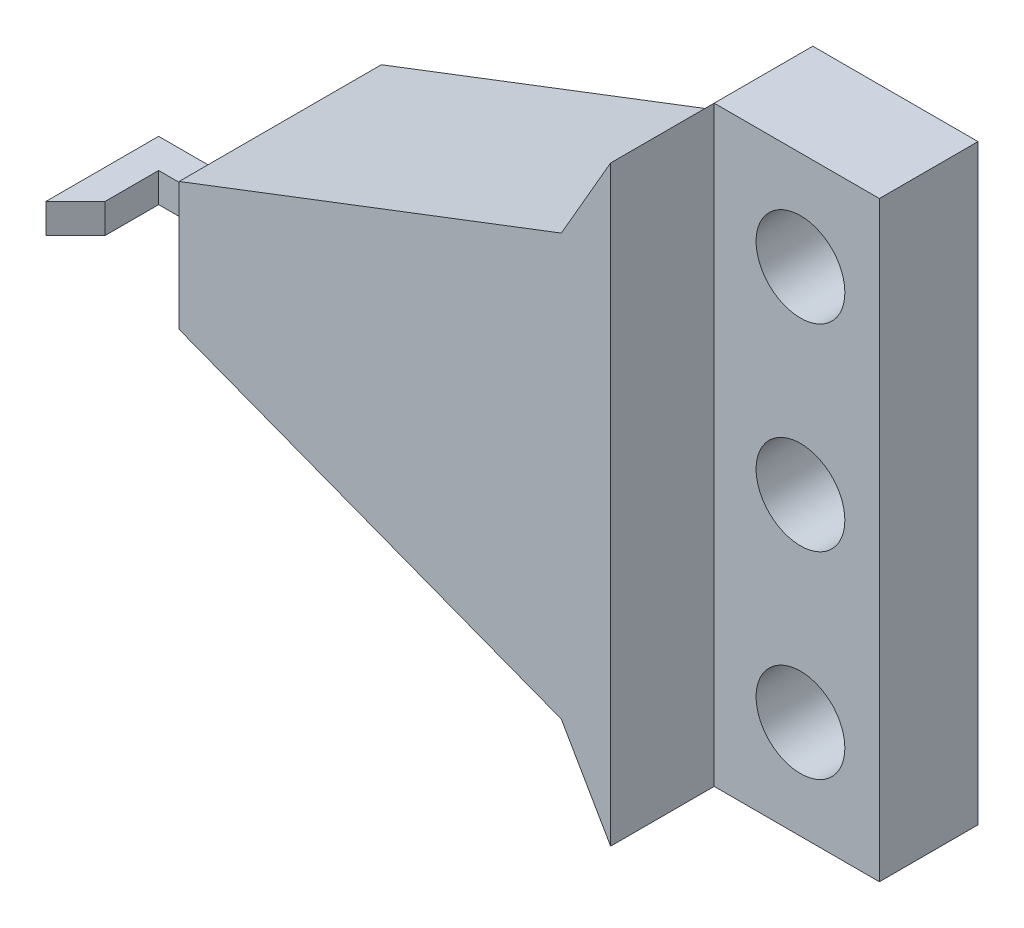
ISO-10303-21;
HEADER;
FILE_DESCRIPTION(('STEP AP214'),'2;1');
FILE_NAME('part.step','',(''),(''),'','','');
FILE_SCHEMA(('AUTOMOTIVE_DESIGN { 1 0 10303 214 1 1 1 1 }'));
ENDSEC;
DATA;
#1=APPLICATION_CONTEXT('core data for automotive mechanical design processes');
#2=APPLICATION_PROTOCOL_DEFINITION('international standard','automotive_design',2000,#1);
#3=PRODUCT_CONTEXT('',#1,'mechanical');
#4=PRODUCT('Part','Part','',(#3));
#5=PRODUCT_RELATED_PRODUCT_CATEGORY('part','',(#4));
#6=PRODUCT_DEFINITION_FORMATION('','',#4);
#7=PRODUCT_DEFINITION_CONTEXT('part definition',#1,'design');
#8=PRODUCT_DEFINITION('design','',#6,#7);
#9=PRODUCT_DEFINITION_SHAPE('','',#8);
#10=(LENGTH_UNIT() NAMED_UNIT(*) SI_UNIT(.MILLI.,.METRE.));
#11=(NAMED_UNIT(*) PLANE_ANGLE_UNIT() SI_UNIT($,.RADIAN.));
#12=(NAMED_UNIT(*) SI_UNIT($,.STERADIAN.) SOLID_ANGLE_UNIT());
#13=UNCERTAINTY_MEASURE_WITH_UNIT(LENGTH_MEASURE(1.E-05),#10,'distance_accuracy_value','');
#14=(GEOMETRIC_REPRESENTATION_CONTEXT(3) GLOBAL_UNCERTAINTY_ASSIGNED_CONTEXT((#13)) GLOBAL_UNIT_ASSIGNED_CONTEXT((#10,
#11,#12)) REPRESENTATION_CONTEXT('',''));
#15=CARTESIAN_POINT('',(0.,0.,0.));
#16=DIRECTION('',(0.,0.,1.));
#17=DIRECTION('',(1.,0.,0.));
#18=AXIS2_PLACEMENT_3D('',#15,#16,#17);
#19=CARTESIAN_POINT('',(-30.734,0.,10.414));
#20=DIRECTION('',(1.,0.,0.));
#21=DIRECTION('',(0.,0.,-1.));
#22=AXIS2_PLACEMENT_3D('',#19,#20,#21);
#23=PLANE('',#22);
#24=DIRECTION('',(0.,-1.,0.));
#25=VECTOR('',#24,1.);
#26=CARTESIAN_POINT('',(-30.734,0.,0.));
#27=LINE('',#26,#25);
#28=CARTESIAN_POINT('',(-30.734,-11.938,0.));
#29=VERTEX_POINT('',#28);
#30=CARTESIAN_POINT('',(-30.734,-18.542,0.));
#31=VERTEX_POINT('',#30);
#32=EDGE_CURVE('E262',#29,#31,#27,.T.);
#33=ORIENTED_EDGE('',*,*,#32,.T.);
#34=DIRECTION('',(0.,0.,-1.));
#35=VECTOR('',#34,1.);
#36=CARTESIAN_POINT('',(-30.734,-18.542,10.414));
#37=LINE('',#36,#35);
#38=CARTESIAN_POINT('',(-30.734,-18.542,10.414));
#39=VERTEX_POINT('',#38);
#40=EDGE_CURVE('E276',#39,#31,#37,.T.);
#41=ORIENTED_EDGE('',*,*,#40,.F.);
#42=DIRECTION('',(0.,-1.,0.));
#43=VECTOR('',#42,1.);
#44=CARTESIAN_POINT('',(-30.734,0.,10.414));
#45=LINE('',#44,#43);
#46=CARTESIAN_POINT('',(-30.734,-11.938,10.414));
#47=VERTEX_POINT('',#46);
#48=EDGE_CURVE('E246',#47,#39,#45,.T.);
#49=ORIENTED_EDGE('',*,*,#48,.F.);
#50=DIRECTION('',(0.,0.,-1.));
#51=VECTOR('',#50,1.);
#52=CARTESIAN_POINT('',(-30.734,-11.938,10.414));
#53=LINE('',#52,#51);
#54=EDGE_CURVE('E280',#47,#29,#53,.T.);
#55=ORIENTED_EDGE('',*,*,#54,.T.);
#56=EDGE_LOOP('',(#33,#41,#49,#55));
#57=FACE_BOUND('',#56,.T.);
#58=DIRECTION('',(0.,0.,1.));
#59=VECTOR('',#58,1.);
#60=CARTESIAN_POINT('',(-30.734,-14.478,0.));
#61=LINE('',#60,#59);
#62=CARTESIAN_POINT('',(-30.734,-14.478,6.39));
#63=VERTEX_POINT('',#62);
#64=CARTESIAN_POINT('',(-30.734,-14.478,7.914));
#65=VERTEX_POINT('',#64);
#66=EDGE_CURVE('E209',#63,#65,#61,.T.);
#67=ORIENTED_EDGE('',*,*,#66,.T.);
#68=DIRECTION('',(0.,-1.,0.));
#69=VECTOR('',#68,1.);
#70=CARTESIAN_POINT('',(-30.734,-14.478,7.914));
#71=LINE('',#70,#69);
#72=CARTESIAN_POINT('',(-30.734,-16.002,7.914));
#73=VERTEX_POINT('',#72);
#74=EDGE_CURVE('E225',#65,#73,#71,.T.);
#75=ORIENTED_EDGE('',*,*,#74,.T.);
#76=DIRECTION('',(0.,0.,1.));
#77=VECTOR('',#76,1.);
#78=CARTESIAN_POINT('',(-30.734,-16.002,0.));
#79=LINE('',#78,#77);
#80=CARTESIAN_POINT('',(-30.734,-16.002,6.39));
#81=VERTEX_POINT('',#80);
#82=EDGE_CURVE('E190',#81,#73,#79,.T.);
#83=ORIENTED_EDGE('',*,*,#82,.F.);
#84=DIRECTION('',(0.,-1.,0.));
#85=VECTOR('',#84,1.);
#86=CARTESIAN_POINT('',(-30.734,-14.478,6.39));
#87=LINE('',#86,#85);
#88=EDGE_CURVE('E229',#63,#81,#87,.T.);
#89=ORIENTED_EDGE('',*,*,#88,.F.);
#90=EDGE_LOOP('',(#67,#75,#83,#89));
#91=FACE_BOUND('',#90,.T.);
#92=ADVANCED_FACE('F45',(#57,#91),#23,.F.);
#93=CARTESIAN_POINT('',(0.,0.,5.08));
#94=DIRECTION('',(0.,-1.,0.));
#95=DIRECTION('',(1.,0.,0.));
#96=AXIS2_PLACEMENT_3D('',#93,#94,#95);
#97=PLANE('',#96);
#98=DIRECTION('',(-1.,0.,0.));
#99=VECTOR('',#98,1.);
#100=CARTESIAN_POINT('',(0.,0.,0.));
#101=LINE('',#100,#99);
#102=CARTESIAN_POINT('',(0.,0.,0.));
#103=VERTEX_POINT('',#102);
#104=CARTESIAN_POINT('',(-8.509,0.,0.));
#105=VERTEX_POINT('',#104);
#106=EDGE_CURVE('E330',#103,#105,#101,.T.);
#107=ORIENTED_EDGE('',*,*,#106,.T.);
#108=DIRECTION('',(0.,0.,-1.));
#109=VECTOR('',#108,1.);
#110=CARTESIAN_POINT('',(-8.509,0.,5.08));
#111=LINE('',#110,#109);
#112=CARTESIAN_POINT('',(-8.509,0.,5.08));
#113=VERTEX_POINT('',#112);
#114=EDGE_CURVE('E11',#113,#105,#111,.T.);
#115=ORIENTED_EDGE('',*,*,#114,.F.);
#116=DIRECTION('',(-1.,0.,0.));
#117=VECTOR('',#116,1.);
#118=CARTESIAN_POINT('',(0.,0.,5.08));
#119=LINE('',#118,#117);
#120=CARTESIAN_POINT('',(0.,0.,5.08));
#121=VERTEX_POINT('',#120);
#122=EDGE_CURVE('E304',#121,#113,#119,.T.);
#123=ORIENTED_EDGE('',*,*,#122,.F.);
#124=DIRECTION('',(0.,0.,-1.));
#125=VECTOR('',#124,1.);
#126=CARTESIAN_POINT('',(0.,0.,5.08));
#127=LINE('',#126,#125);
#128=EDGE_CURVE('E70',#121,#103,#127,.T.);
#129=ORIENTED_EDGE('',*,*,#128,.T.);
#130=EDGE_LOOP('',(#107,#115,#123,#129));
#131=FACE_BOUND('',#130,.T.);
#132=ADVANCED_FACE('F392',(#131),#97,.F.);
#133=CARTESIAN_POINT('',(0.,-30.48,5.08));
#134=DIRECTION('',(0.,-1.,0.));
#135=DIRECTION('',(1.,0.,0.));
#136=AXIS2_PLACEMENT_3D('',#133,#134,#135);
#137=PLANE('',#136);
#138=DIRECTION('',(-1.,0.,0.));
#139=VECTOR('',#138,1.);
#140=CARTESIAN_POINT('',(0.,-30.48,0.));
#141=LINE('',#140,#139);
#142=CARTESIAN_POINT('',(0.,-30.48,0.));
#143=VERTEX_POINT('',#142);
#144=CARTESIAN_POINT('',(-8.509,-30.48,0.));
#145=VERTEX_POINT('',#144);
#146=EDGE_CURVE('E333',#143,#145,#141,.T.);
#147=ORIENTED_EDGE('',*,*,#146,.F.);
#148=DIRECTION('',(0.,0.,-1.));
#149=VECTOR('',#148,1.);
#150=CARTESIAN_POINT('',(0.,-30.48,5.08));
#151=LINE('',#150,#149);
#152=CARTESIAN_POINT('',(0.,-30.48,5.08));
#153=VERTEX_POINT('',#152);
#154=EDGE_CURVE('E342',#153,#143,#151,.T.);
#155=ORIENTED_EDGE('',*,*,#154,.F.);
#156=DIRECTION('',(-1.,0.,0.));
#157=VECTOR('',#156,1.);
#158=CARTESIAN_POINT('',(0.,-30.48,5.08));
#159=LINE('',#158,#157);
#160=CARTESIAN_POINT('',(-8.509,-30.48,5.08));
#161=VERTEX_POINT('',#160);
#162=EDGE_CURVE('E312',#153,#161,#159,.T.);
#163=ORIENTED_EDGE('',*,*,#162,.T.);
#164=DIRECTION('',(0.,0.,-1.));
#165=VECTOR('',#164,1.);
#166=CARTESIAN_POINT('',(-8.509,-30.48,5.08));
#167=LINE('',#166,#165);
#168=EDGE_CURVE('E54',#161,#145,#167,.T.);
#169=ORIENTED_EDGE('',*,*,#168,.T.);
#170=EDGE_LOOP('',(#147,#155,#163,#169));
#171=FACE_BOUND('',#170,.T.);
#172=ADVANCED_FACE('F348',(#171),#137,.T.);
#173=CARTESIAN_POINT('',(-4.064,-5.08,5.08));
#174=DIRECTION('',(0.,0.,-1.));
#175=DIRECTION('',(-1.,0.,0.));
#176=AXIS2_PLACEMENT_3D('',#173,#174,#175);
#177=CYLINDRICAL_SURFACE('',#176,2.286);
#178=CARTESIAN_POINT('',(-4.064,-5.08,5.08));
#179=DIRECTION('',(0.,0.,1.));
#180=DIRECTION('',(1.,0.,0.));
#181=AXIS2_PLACEMENT_3D('',#178,#179,#180);
#182=CIRCLE('',#181,2.286);
#183=CARTESIAN_POINT('',(-1.778,-5.08,5.08));
#184=VERTEX_POINT('',#183);
#185=EDGE_CURVE('E300',#184,#184,#182,.T.);
#186=ORIENTED_EDGE('',*,*,#185,.T.);
#187=EDGE_LOOP('',(#186));
#188=FACE_BOUND('',#187,.T.);
#189=CARTESIAN_POINT('',(-4.064,-5.08,0.));
#190=DIRECTION('',(0.,0.,1.));
#191=DIRECTION('',(1.,0.,0.));
#192=AXIS2_PLACEMENT_3D('',#189,#190,#191);
#193=CIRCLE('',#192,2.286);
#194=CARTESIAN_POINT('',(-1.778,-5.08,0.));
#195=VERTEX_POINT('',#194);
#196=EDGE_CURVE('E326',#195,#195,#193,.T.);
#197=ORIENTED_EDGE('',*,*,#196,.F.);
#198=EDGE_LOOP('',(#197));
#199=FACE_BOUND('',#198,.T.);
#200=ADVANCED_FACE('F414',(#188,#199),#177,.F.);
#201=CARTESIAN_POINT('',(-4.064,-25.4,5.08));
#202=DIRECTION('',(0.,0.,-1.));
#203=DIRECTION('',(-1.,0.,0.));
#204=AXIS2_PLACEMENT_3D('',#201,#202,#203);
#205=CYLINDRICAL_SURFACE('',#204,2.286);
#206=CARTESIAN_POINT('',(-4.064,-25.4,5.08));
#207=DIRECTION('',(0.,0.,1.));
#208=DIRECTION('',(1.,0.,0.));
#209=AXIS2_PLACEMENT_3D('',#206,#207,#208);
#210=CIRCLE('',#209,2.286);
#211=CARTESIAN_POINT('',(-1.778,-25.4,5.08));
#212=VERTEX_POINT('',#211);
#213=EDGE_CURVE('E295',#212,#212,#210,.T.);
#214=ORIENTED_EDGE('',*,*,#213,.T.);
#215=EDGE_LOOP('',(#214));
#216=FACE_BOUND('',#215,.T.);
#217=CARTESIAN_POINT('',(-4.064,-25.4,0.));
#218=DIRECTION('',(0.,0.,1.));
#219=DIRECTION('',(1.,0.,0.));
#220=AXIS2_PLACEMENT_3D('',#217,#218,#219);
#221=CIRCLE('',#220,2.286);
#222=CARTESIAN_POINT('',(-1.778,-25.4,0.));
#223=VERTEX_POINT('',#222);
#224=EDGE_CURVE('E322',#223,#223,#221,.T.);
#225=ORIENTED_EDGE('',*,*,#224,.F.);
#226=EDGE_LOOP('',(#225));
#227=FACE_BOUND('',#226,.T.);
#228=ADVANCED_FACE('F417',(#216,#227),#205,.F.);
#229=CARTESIAN_POINT('',(-4.064,-15.24,5.08));
#230=DIRECTION('',(0.,0.,-1.));
#231=DIRECTION('',(-1.,0.,0.));
#232=AXIS2_PLACEMENT_3D('',#229,#230,#231);
#233=CYLINDRICAL_SURFACE('',#232,2.286);
#234=CARTESIAN_POINT('',(-4.064,-15.24,5.08));
#235=DIRECTION('',(0.,0.,1.));
#236=DIRECTION('',(1.,0.,0.));
#237=AXIS2_PLACEMENT_3D('',#234,#235,#236);
#238=CIRCLE('',#237,2.286);
#239=CARTESIAN_POINT('',(-1.778,-15.24,5.08));
#240=VERTEX_POINT('',#239);
#241=EDGE_CURVE('E291',#240,#240,#238,.T.);
#242=ORIENTED_EDGE('',*,*,#241,.T.);
#243=EDGE_LOOP('',(#242));
#244=FACE_BOUND('',#243,.T.);
#245=CARTESIAN_POINT('',(-4.064,-15.24,0.));
#246=DIRECTION('',(0.,0.,1.));
#247=DIRECTION('',(1.,0.,0.));
#248=AXIS2_PLACEMENT_3D('',#245,#246,#247);
#249=CIRCLE('',#248,2.286);
#250=CARTESIAN_POINT('',(-1.778,-15.24,0.));
#251=VERTEX_POINT('',#250);
#252=EDGE_CURVE('E290',#251,#251,#249,.T.);
#253=ORIENTED_EDGE('',*,*,#252,.F.);
#254=EDGE_LOOP('',(#253));
#255=FACE_BOUND('',#254,.T.);
#256=ADVANCED_FACE('F47',(#244,#255),#233,.F.);
#257=CARTESIAN_POINT('',(0.,0.,5.08));
#258=DIRECTION('',(1.,0.,0.));
#259=DIRECTION('',(0.,0.,-1.));
#260=AXIS2_PLACEMENT_3D('',#257,#258,#259);
#261=PLANE('',#260);
#262=DIRECTION('',(0.,-1.,0.));
#263=VECTOR('',#262,1.);
#264=CARTESIAN_POINT('',(0.,0.,0.));
#265=LINE('',#264,#263);
#266=EDGE_CURVE('E296',#103,#143,#265,.T.);
#267=ORIENTED_EDGE('',*,*,#266,.F.);
#268=ORIENTED_EDGE('',*,*,#128,.F.);
#269=DIRECTION('',(0.,-1.,0.));
#270=VECTOR('',#269,1.);
#271=CARTESIAN_POINT('',(0.,0.,5.08));
#272=LINE('',#271,#270);
#273=EDGE_CURVE('E316',#121,#153,#272,.T.);
#274=ORIENTED_EDGE('',*,*,#273,.T.);
#275=ORIENTED_EDGE('',*,*,#154,.T.);
#276=EDGE_LOOP('',(#267,#268,#274,#275));
#277=FACE_BOUND('',#276,.T.);
#278=ADVANCED_FACE('F355',(#277),#261,.T.);
#279=CARTESIAN_POINT('',(0.,0.,5.08));
#280=DIRECTION('',(0.,0.,1.));
#281=DIRECTION('',(1.,0.,0.));
#282=AXIS2_PLACEMENT_3D('',#279,#280,#281);
#283=PLANE('',#282);
#284=ORIENTED_EDGE('',*,*,#241,.F.);
#285=EDGE_LOOP('',(#284));
#286=FACE_BOUND('',#285,.T.);
#287=ORIENTED_EDGE('',*,*,#213,.F.);
#288=EDGE_LOOP('',(#287));
#289=FACE_BOUND('',#288,.T.);
#290=ORIENTED_EDGE('',*,*,#185,.F.);
#291=EDGE_LOOP('',(#290));
#292=FACE_BOUND('',#291,.T.);
#293=ORIENTED_EDGE('',*,*,#122,.T.);
#294=DIRECTION('',(0.,-1.,0.));
#295=VECTOR('',#294,1.);
#296=CARTESIAN_POINT('',(-8.509,0.,5.08));
#297=LINE('',#296,#295);
#298=EDGE_CURVE('E308',#113,#161,#297,.T.);
#299=ORIENTED_EDGE('',*,*,#298,.T.);
#300=ORIENTED_EDGE('',*,*,#162,.F.);
#301=ORIENTED_EDGE('',*,*,#273,.F.);
#302=EDGE_LOOP('',(#293,#299,#300,#301));
#303=FACE_BOUND('',#302,.T.);
#304=ADVANCED_FACE('F358',(#286,#289,#292,#303),#283,.T.);
#305=CARTESIAN_POINT('',(0.,0.,0.));
#306=DIRECTION('',(0.,0.,1.));
#307=DIRECTION('',(1.,0.,0.));
#308=AXIS2_PLACEMENT_3D('',#305,#306,#307);
#309=PLANE('',#308);
#310=ORIENTED_EDGE('',*,*,#252,.T.);
#311=EDGE_LOOP('',(#310));
#312=FACE_BOUND('',#311,.T.);
#313=ORIENTED_EDGE('',*,*,#224,.T.);
#314=EDGE_LOOP('',(#313));
#315=FACE_BOUND('',#314,.T.);
#316=ORIENTED_EDGE('',*,*,#196,.T.);
#317=EDGE_LOOP('',(#316));
#318=FACE_BOUND('',#317,.T.);
#319=ORIENTED_EDGE('',*,*,#106,.F.);
#320=ORIENTED_EDGE('',*,*,#266,.T.);
#321=ORIENTED_EDGE('',*,*,#146,.T.);
#322=DIRECTION('',(0.500000000000002,-0.866025403784438,0.));
#323=VECTOR('',#322,1.);
#324=CARTESIAN_POINT('',(-19.5799771536749,-11.304505080401,0.));
#325=LINE('',#324,#323);
#326=CARTESIAN_POINT('',(-11.049,-26.0805909487751,0.));
#327=VERTEX_POINT('',#326);
#328=EDGE_CURVE('E238',#327,#145,#325,.T.);
#329=ORIENTED_EDGE('',*,*,#328,.F.);
#330=DIRECTION('',(0.933862221498671,-0.357632984017927,0.));
#331=VECTOR('',#330,1.);
#332=CARTESIAN_POINT('',(-10.1235760460527,-26.4349924038428,0.));
#333=LINE('',#332,#331);
#334=EDGE_CURVE('E265',#31,#327,#333,.T.);
#335=ORIENTED_EDGE('',*,*,#334,.F.);
#336=ORIENTED_EDGE('',*,*,#32,.F.);
#337=DIRECTION('',(0.933862221498672,0.357632984017924,0.));
#338=VECTOR('',#337,1.);
#339=CARTESIAN_POINT('',(0.0561323098420991,-0.146574409826716,0.));
#340=LINE('',#339,#338);
#341=CARTESIAN_POINT('',(-11.049,-4.39940905122497,0.));
#342=VERTEX_POINT('',#341);
#343=EDGE_CURVE('E258',#29,#342,#340,.T.);
#344=ORIENTED_EDGE('',*,*,#343,.T.);
#345=DIRECTION('',(0.499999999999995,0.866025403784442,0.));
#346=VECTOR('',#345,1.);
#347=CARTESIAN_POINT('',(-6.38175000000005,3.68450508040087,0.));
#348=LINE('',#347,#346);
#349=EDGE_CURVE('E221',#342,#105,#348,.T.);
#350=ORIENTED_EDGE('',*,*,#349,.T.);
#351=EDGE_LOOP('',(#319,#320,#321,#329,#335,#336,#344,#350));
#352=FACE_BOUND('',#351,.T.);
#353=ADVANCED_FACE('F353',(#312,#315,#318,#352),#309,.F.);
#354=CARTESIAN_POINT('',(-8.509,0.,10.414));
#355=DIRECTION('',(1.,0.,0.));
#356=DIRECTION('',(0.,0.,-1.));
#357=AXIS2_PLACEMENT_3D('',#354,#355,#356);
#358=PLANE('',#357);
#359=ORIENTED_EDGE('',*,*,#298,.F.);
#360=DIRECTION('',(0.,0.,-1.));
#361=VECTOR('',#360,1.);
#362=CARTESIAN_POINT('',(-8.509,0.,10.414));
#363=LINE('',#362,#361);
#364=CARTESIAN_POINT('',(-8.509,0.,10.414));
#365=VERTEX_POINT('',#364);
#366=EDGE_CURVE('E286',#365,#113,#363,.T.);
#367=ORIENTED_EDGE('',*,*,#366,.F.);
#368=DIRECTION('',(0.,-1.,0.));
#369=VECTOR('',#368,1.);
#370=CARTESIAN_POINT('',(-8.509,0.,10.414));
#371=LINE('',#370,#369);
#372=CARTESIAN_POINT('',(-8.509,-30.48,10.414));
#373=VERTEX_POINT('',#372);
#374=EDGE_CURVE('E234',#365,#373,#371,.T.);
#375=ORIENTED_EDGE('',*,*,#374,.T.);
#376=DIRECTION('',(0.,0.,-1.));
#377=VECTOR('',#376,1.);
#378=CARTESIAN_POINT('',(-8.509,-30.48,10.414));
#379=LINE('',#378,#377);
#380=EDGE_CURVE('E89',#373,#161,#379,.T.);
#381=ORIENTED_EDGE('',*,*,#380,.T.);
#382=EDGE_LOOP('',(#359,#367,#375,#381));
#383=FACE_BOUND('',#382,.T.);
#384=ADVANCED_FACE('F360',(#383),#358,.T.);
#385=CARTESIAN_POINT('',(-6.38175000000005,3.68450508040087,10.414));
#386=DIRECTION('',(-0.866025403784442,0.499999999999995,0.));
#387=DIRECTION('',(-0.499999999999995,-0.866025403784442,0.));
#388=AXIS2_PLACEMENT_3D('',#385,#386,#387);
#389=PLANE('',#388);
#390=ORIENTED_EDGE('',*,*,#349,.F.);
#391=DIRECTION('',(0.,0.,-1.));
#392=VECTOR('',#391,1.);
#393=CARTESIAN_POINT('',(-11.049,-4.39940905122497,10.414));
#394=LINE('',#393,#392);
#395=CARTESIAN_POINT('',(-11.049,-4.39940905122497,10.414));
#396=VERTEX_POINT('',#395);
#397=EDGE_CURVE('E283',#396,#342,#394,.T.);
#398=ORIENTED_EDGE('',*,*,#397,.F.);
#399=DIRECTION('',(0.499999999999995,0.866025403784442,0.));
#400=VECTOR('',#399,1.);
#401=CARTESIAN_POINT('',(-6.38175000000005,3.68450508040087,10.414));
#402=LINE('',#401,#400);
#403=EDGE_CURVE('E237',#396,#365,#402,.T.);
#404=ORIENTED_EDGE('',*,*,#403,.T.);
#405=ORIENTED_EDGE('',*,*,#366,.T.);
#406=ORIENTED_EDGE('',*,*,#114,.T.);
#407=EDGE_LOOP('',(#390,#398,#404,#405,#406));
#408=FACE_BOUND('',#407,.T.);
#409=ADVANCED_FACE('F364',(#408),#389,.T.);
#410=CARTESIAN_POINT('',(0.0561323098420991,-0.146574409826716,10.414));
#411=DIRECTION('',(-0.357632984017924,0.933862221498672,0.));
#412=DIRECTION('',(-0.933862221498673,-0.357632984017924,0.));
#413=AXIS2_PLACEMENT_3D('',#410,#411,#412);
#414=PLANE('',#413);
#415=ORIENTED_EDGE('',*,*,#343,.F.);
#416=ORIENTED_EDGE('',*,*,#54,.F.);
#417=DIRECTION('',(0.933862221498672,0.357632984017924,0.));
#418=VECTOR('',#417,1.);
#419=CARTESIAN_POINT('',(0.0561323098420991,-0.146574409826716,10.414));
#420=LINE('',#419,#418);
#421=EDGE_CURVE('E242',#47,#396,#420,.T.);
#422=ORIENTED_EDGE('',*,*,#421,.T.);
#423=ORIENTED_EDGE('',*,*,#397,.T.);
#424=EDGE_LOOP('',(#415,#416,#422,#423));
#425=FACE_BOUND('',#424,.T.);
#426=ADVANCED_FACE('F371',(#425),#414,.T.);
#427=CARTESIAN_POINT('',(-10.1235760460527,-26.4349924038428,10.414));
#428=DIRECTION('',(0.357632984017927,0.933862221498671,0.));
#429=DIRECTION('',(-0.933862221498671,0.357632984017927,0.));
#430=AXIS2_PLACEMENT_3D('',#427,#428,#429);
#431=PLANE('',#430);
#432=ORIENTED_EDGE('',*,*,#334,.T.);
#433=DIRECTION('',(0.,0.,-1.));
#434=VECTOR('',#433,1.);
#435=CARTESIAN_POINT('',(-11.049,-26.0805909487751,10.414));
#436=LINE('',#435,#434);
#437=CARTESIAN_POINT('',(-11.049,-26.0805909487751,10.414));
#438=VERTEX_POINT('',#437);
#439=EDGE_CURVE('E272',#438,#327,#436,.T.);
#440=ORIENTED_EDGE('',*,*,#439,.F.);
#441=DIRECTION('',(0.933862221498671,-0.357632984017927,0.));
#442=VECTOR('',#441,1.);
#443=CARTESIAN_POINT('',(-10.1235760460527,-26.4349924038428,10.414));
#444=LINE('',#443,#442);
#445=EDGE_CURVE('E249',#39,#438,#444,.T.);
#446=ORIENTED_EDGE('',*,*,#445,.F.);
#447=ORIENTED_EDGE('',*,*,#40,.T.);
#448=EDGE_LOOP('',(#432,#440,#446,#447));
#449=FACE_BOUND('',#448,.T.);
#450=ADVANCED_FACE('F381',(#449),#431,.F.);
#451=CARTESIAN_POINT('',(-19.5799771536749,-11.304505080401,10.414));
#452=DIRECTION('',(0.866025403784438,0.500000000000002,0.));
#453=DIRECTION('',(-0.500000000000002,0.866025403784438,0.));
#454=AXIS2_PLACEMENT_3D('',#451,#452,#453);
#455=PLANE('',#454);
#456=ORIENTED_EDGE('',*,*,#328,.T.);
#457=ORIENTED_EDGE('',*,*,#168,.F.);
#458=ORIENTED_EDGE('',*,*,#380,.F.);
#459=DIRECTION('',(0.500000000000002,-0.866025403784438,0.));
#460=VECTOR('',#459,1.);
#461=CARTESIAN_POINT('',(-19.5799771536749,-11.304505080401,10.414));
#462=LINE('',#461,#460);
#463=EDGE_CURVE('E252',#438,#373,#462,.T.);
#464=ORIENTED_EDGE('',*,*,#463,.F.);
#465=ORIENTED_EDGE('',*,*,#439,.T.);
#466=EDGE_LOOP('',(#456,#457,#458,#464,#465));
#467=FACE_BOUND('',#466,.T.);
#468=ADVANCED_FACE('F382',(#467),#455,.F.);
#469=CARTESIAN_POINT('',(0.,0.,10.414));
#470=DIRECTION('',(0.,0.,1.));
#471=DIRECTION('',(1.,0.,0.));
#472=AXIS2_PLACEMENT_3D('',#469,#470,#471);
#473=PLANE('',#472);
#474=ORIENTED_EDGE('',*,*,#374,.F.);
#475=ORIENTED_EDGE('',*,*,#403,.F.);
#476=ORIENTED_EDGE('',*,*,#421,.F.);
#477=ORIENTED_EDGE('',*,*,#48,.T.);
#478=ORIENTED_EDGE('',*,*,#445,.T.);
#479=ORIENTED_EDGE('',*,*,#463,.T.);
#480=EDGE_LOOP('',(#474,#475,#476,#477,#478,#479));
#481=FACE_BOUND('',#480,.T.);
#482=ADVANCED_FACE('F368',(#481),#473,.T.);
#483=CARTESIAN_POINT('',(-11.811,-14.478,-11.811));
#484=DIRECTION('',(-0.707106781186548,0.,-0.707106781186547));
#485=DIRECTION('',(-0.707106781186547,0.,0.707106781186548));
#486=AXIS2_PLACEMENT_3D('',#483,#484,#485);
#487=PLANE('',#486);
#488=DIRECTION('',(0.,-1.,0.));
#489=VECTOR('',#488,1.);
#490=CARTESIAN_POINT('',(-35.814,-14.478,12.192));
#491=LINE('',#490,#489);
#492=CARTESIAN_POINT('',(-35.814,-14.478,12.192));
#493=VERTEX_POINT('',#492);
#494=CARTESIAN_POINT('',(-35.814,-16.002,12.192));
#495=VERTEX_POINT('',#494);
#496=EDGE_CURVE('E163',#493,#495,#491,.T.);
#497=ORIENTED_EDGE('',*,*,#496,.T.);
#498=DIRECTION('',(0.707106781186547,0.,-0.707106781186548));
#499=VECTOR('',#498,1.);
#500=CARTESIAN_POINT('',(-11.811,-16.002,-11.811));
#501=LINE('',#500,#499);
#502=CARTESIAN_POINT('',(-34.29,-16.002,10.668));
#503=VERTEX_POINT('',#502);
#504=EDGE_CURVE('E167',#495,#503,#501,.T.);
#505=ORIENTED_EDGE('',*,*,#504,.T.);
#506=DIRECTION('',(0.,-1.,0.));
#507=VECTOR('',#506,1.);
#508=CARTESIAN_POINT('',(-34.29,-14.478,10.668));
#509=LINE('',#508,#507);
#510=CARTESIAN_POINT('',(-34.29,-14.478,10.668));
#511=VERTEX_POINT('',#510);
#512=EDGE_CURVE('E218',#511,#503,#509,.T.);
#513=ORIENTED_EDGE('',*,*,#512,.F.);
#514=DIRECTION('',(0.707106781186547,0.,-0.707106781186548));
#515=VECTOR('',#514,1.);
#516=CARTESIAN_POINT('',(-11.811,-14.478,-11.811));
#517=LINE('',#516,#515);
#518=EDGE_CURVE('E170',#493,#511,#517,.T.);
#519=ORIENTED_EDGE('',*,*,#518,.F.);
#520=EDGE_LOOP('',(#497,#505,#513,#519));
#521=FACE_BOUND('',#520,.T.);
#522=ADVANCED_FACE('F165',(#521),#487,.F.);
#523=CARTESIAN_POINT('',(-34.29,-14.478,0.));
#524=DIRECTION('',(-1.,0.,0.));
#525=DIRECTION('',(0.,0.,1.));
#526=AXIS2_PLACEMENT_3D('',#523,#524,#525);
#527=PLANE('',#526);
#528=ORIENTED_EDGE('',*,*,#512,.T.);
#529=DIRECTION('',(0.,0.,-1.));
#530=VECTOR('',#529,1.);
#531=CARTESIAN_POINT('',(-34.29,-16.002,0.));
#532=LINE('',#531,#530);
#533=CARTESIAN_POINT('',(-34.29,-16.002,7.914));
#534=VERTEX_POINT('',#533);
#535=EDGE_CURVE('E182',#503,#534,#532,.T.);
#536=ORIENTED_EDGE('',*,*,#535,.T.);
#537=DIRECTION('',(0.,-1.,0.));
#538=VECTOR('',#537,1.);
#539=CARTESIAN_POINT('',(-34.29,-14.478,7.914));
#540=LINE('',#539,#538);
#541=CARTESIAN_POINT('',(-34.29,-14.478,7.914));
#542=VERTEX_POINT('',#541);
#543=EDGE_CURVE('E222',#542,#534,#540,.T.);
#544=ORIENTED_EDGE('',*,*,#543,.F.);
#545=DIRECTION('',(0.,0.,-1.));
#546=VECTOR('',#545,1.);
#547=CARTESIAN_POINT('',(-34.29,-14.478,0.));
#548=LINE('',#547,#546);
#549=EDGE_CURVE('E176',#511,#542,#548,.T.);
#550=ORIENTED_EDGE('',*,*,#549,.F.);
#551=EDGE_LOOP('',(#528,#536,#544,#550));
#552=FACE_BOUND('',#551,.T.);
#553=ADVANCED_FACE('F498',(#552),#527,.F.);
#554=CARTESIAN_POINT('',(0.,-14.478,7.914));
#555=DIRECTION('',(0.,0.,-1.));
#556=DIRECTION('',(-1.,0.,0.));
#557=AXIS2_PLACEMENT_3D('',#554,#555,#556);
#558=PLANE('',#557);
#559=ORIENTED_EDGE('',*,*,#543,.T.);
#560=DIRECTION('',(1.,0.,0.));
#561=VECTOR('',#560,1.);
#562=CARTESIAN_POINT('',(0.,-16.002,7.914));
#563=LINE('',#562,#561);
#564=EDGE_CURVE('E195',#534,#73,#563,.T.);
#565=ORIENTED_EDGE('',*,*,#564,.T.);
#566=ORIENTED_EDGE('',*,*,#74,.F.);
#567=DIRECTION('',(1.,0.,0.));
#568=VECTOR('',#567,1.);
#569=CARTESIAN_POINT('',(0.,-14.478,7.914));
#570=LINE('',#569,#568);
#571=EDGE_CURVE('E213',#542,#65,#570,.T.);
#572=ORIENTED_EDGE('',*,*,#571,.F.);
#573=EDGE_LOOP('',(#559,#565,#566,#572));
#574=FACE_BOUND('',#573,.T.);
#575=ADVANCED_FACE('F507',(#574),#558,.F.);
#576=CARTESIAN_POINT('',(0.,-14.478,6.39));
#577=DIRECTION('',(0.,0.,1.));
#578=DIRECTION('',(1.,0.,0.));
#579=AXIS2_PLACEMENT_3D('',#576,#577,#578);
#580=PLANE('',#579);
#581=ORIENTED_EDGE('',*,*,#88,.T.);
#582=DIRECTION('',(-1.,0.,0.));
#583=VECTOR('',#582,1.);
#584=CARTESIAN_POINT('',(0.,-16.002,6.39));
#585=LINE('',#584,#583);
#586=CARTESIAN_POINT('',(-35.814,-16.002,6.39));
#587=VERTEX_POINT('',#586);
#588=EDGE_CURVE('E61',#81,#587,#585,.T.);
#589=ORIENTED_EDGE('',*,*,#588,.T.);
#590=DIRECTION('',(0.,-1.,0.));
#591=VECTOR('',#590,1.);
#592=CARTESIAN_POINT('',(-35.814,-14.478,6.39));
#593=LINE('',#592,#591);
#594=CARTESIAN_POINT('',(-35.814,-14.478,6.39));
#595=VERTEX_POINT('',#594);
#596=EDGE_CURVE('E175',#595,#587,#593,.T.);
#597=ORIENTED_EDGE('',*,*,#596,.F.);
#598=DIRECTION('',(-1.,0.,0.));
#599=VECTOR('',#598,1.);
#600=CARTESIAN_POINT('',(0.,-14.478,6.39));
#601=LINE('',#600,#599);
#602=EDGE_CURVE('E206',#63,#595,#601,.T.);
#603=ORIENTED_EDGE('',*,*,#602,.F.);
#604=EDGE_LOOP('',(#581,#589,#597,#603));
#605=FACE_BOUND('',#604,.T.);
#606=ADVANCED_FACE('F518',(#605),#580,.F.);
#607=CARTESIAN_POINT('',(-35.814,-14.478,0.));
#608=DIRECTION('',(1.,0.,0.));
#609=DIRECTION('',(0.,0.,-1.));
#610=AXIS2_PLACEMENT_3D('',#607,#608,#609);
#611=PLANE('',#610);
#612=ORIENTED_EDGE('',*,*,#596,.T.);
#613=DIRECTION('',(0.,0.,1.));
#614=VECTOR('',#613,1.);
#615=CARTESIAN_POINT('',(-35.814,-16.002,0.));
#616=LINE('',#615,#614);
#617=EDGE_CURVE('E179',#587,#495,#616,.T.);
#618=ORIENTED_EDGE('',*,*,#617,.T.);
#619=ORIENTED_EDGE('',*,*,#496,.F.);
#620=DIRECTION('',(0.,0.,1.));
#621=VECTOR('',#620,1.);
#622=CARTESIAN_POINT('',(-35.814,-14.478,0.));
#623=LINE('',#622,#621);
#624=EDGE_CURVE('E203',#595,#493,#623,.T.);
#625=ORIENTED_EDGE('',*,*,#624,.F.);
#626=EDGE_LOOP('',(#612,#618,#619,#625));
#627=FACE_BOUND('',#626,.T.);
#628=ADVANCED_FACE('F185',(#627),#611,.F.);
#629=CARTESIAN_POINT('',(0.,-14.478,0.));
#630=DIRECTION('',(0.,-1.,0.));
#631=DIRECTION('',(0.,0.,-1.));
#632=AXIS2_PLACEMENT_3D('',#629,#630,#631);
#633=PLANE('',#632);
#634=ORIENTED_EDGE('',*,*,#518,.T.);
#635=ORIENTED_EDGE('',*,*,#549,.T.);
#636=ORIENTED_EDGE('',*,*,#571,.T.);
#637=ORIENTED_EDGE('',*,*,#66,.F.);
#638=ORIENTED_EDGE('',*,*,#602,.T.);
#639=ORIENTED_EDGE('',*,*,#624,.T.);
#640=EDGE_LOOP('',(#634,#635,#636,#637,#638,#639));
#641=FACE_BOUND('',#640,.T.);
#642=ADVANCED_FACE('F539',(#641),#633,.F.);
#643=CARTESIAN_POINT('',(0.,-16.002,0.));
#644=DIRECTION('',(0.,-1.,0.));
#645=DIRECTION('',(0.,0.,-1.));
#646=AXIS2_PLACEMENT_3D('',#643,#644,#645);
#647=PLANE('',#646);
#648=ORIENTED_EDGE('',*,*,#504,.F.);
#649=ORIENTED_EDGE('',*,*,#617,.F.);
#650=ORIENTED_EDGE('',*,*,#588,.F.);
#651=ORIENTED_EDGE('',*,*,#82,.T.);
#652=ORIENTED_EDGE('',*,*,#564,.F.);
#653=ORIENTED_EDGE('',*,*,#535,.F.);
#654=EDGE_LOOP('',(#648,#649,#650,#651,#652,#653));
#655=FACE_BOUND('',#654,.T.);
#656=ADVANCED_FACE('F178',(#655),#647,.T.);
#657=CLOSED_SHELL('',(#92,#132,#172,#200,#228,#256,#278,#304,#353,#384,#409,#426,#450,#468,#482,
#522,#553,#575,#606,#628,#642,#656));
#658=MANIFOLD_SOLID_BREP('B2',#657);
#659=ADVANCED_BREP_SHAPE_REPRESENTATION('',(#18,#658),#14);
#660=SHAPE_DEFINITION_REPRESENTATION(#9,#659);
ENDSEC;
END-ISO-10303-21;
